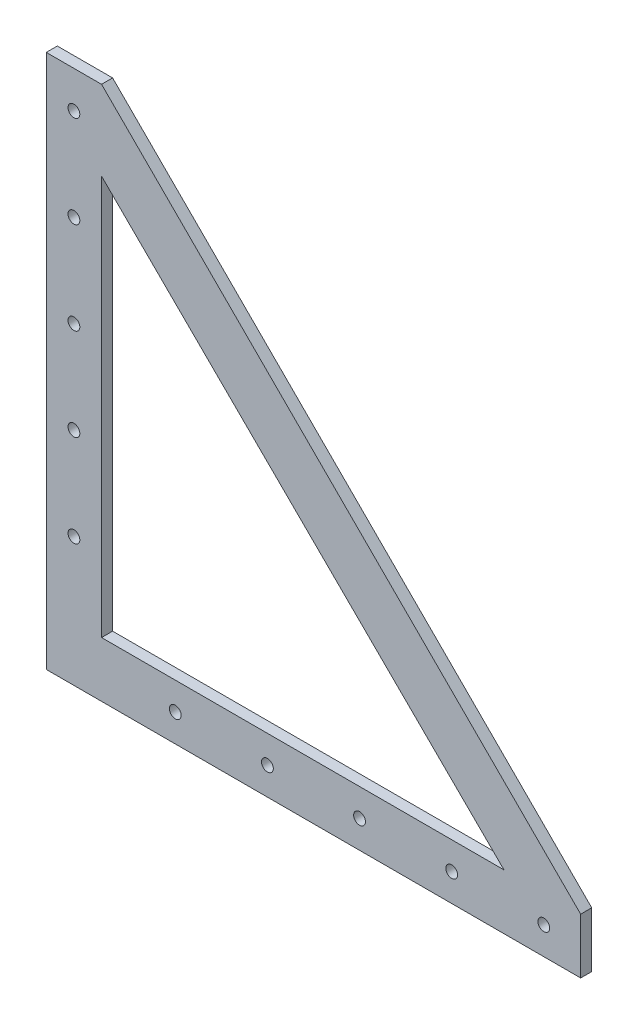
ISO-10303-21;
HEADER;
FILE_DESCRIPTION(('STEP AP214'),'2;1');
FILE_NAME('part.step','',(''),(''),'','','');
FILE_SCHEMA(('AUTOMOTIVE_DESIGN { 1 0 10303 214 1 1 1 1 }'));
ENDSEC;
DATA;
#1=APPLICATION_CONTEXT('core data for automotive mechanical design processes');
#2=APPLICATION_PROTOCOL_DEFINITION('international standard','automotive_design',2000,#1);
#3=PRODUCT_CONTEXT('',#1,'mechanical');
#4=PRODUCT('Part','Part','',(#3));
#5=PRODUCT_RELATED_PRODUCT_CATEGORY('part','',(#4));
#6=PRODUCT_DEFINITION_FORMATION('','',#4);
#7=PRODUCT_DEFINITION_CONTEXT('part definition',#1,'design');
#8=PRODUCT_DEFINITION('design','',#6,#7);
#9=PRODUCT_DEFINITION_SHAPE('','',#8);
#10=(LENGTH_UNIT() NAMED_UNIT(*) SI_UNIT(.MILLI.,.METRE.));
#11=(NAMED_UNIT(*) PLANE_ANGLE_UNIT() SI_UNIT($,.RADIAN.));
#12=(NAMED_UNIT(*) SI_UNIT($,.STERADIAN.) SOLID_ANGLE_UNIT());
#13=UNCERTAINTY_MEASURE_WITH_UNIT(LENGTH_MEASURE(1.E-05),#10,'distance_accuracy_value','');
#14=(GEOMETRIC_REPRESENTATION_CONTEXT(3) GLOBAL_UNCERTAINTY_ASSIGNED_CONTEXT((#13)) GLOBAL_UNIT_ASSIGNED_CONTEXT((#10,
#11,#12)) REPRESENTATION_CONTEXT('',''));
#15=CARTESIAN_POINT('',(0.,0.,0.));
#16=DIRECTION('',(0.,0.,1.));
#17=DIRECTION('',(1.,0.,0.));
#18=AXIS2_PLACEMENT_3D('',#15,#16,#17);
#19=CARTESIAN_POINT('',(0.,0.,3.));
#20=DIRECTION('',(0.,0.,1.));
#21=DIRECTION('',(1.,0.,0.));
#22=AXIS2_PLACEMENT_3D('',#19,#20,#21);
#23=PLANE('',#22);
#24=CARTESIAN_POINT('',(7.50000000000079,60.,3.));
#25=DIRECTION('',(0.,0.,1.));
#26=DIRECTION('',(1.,0.,0.));
#27=AXIS2_PLACEMENT_3D('',#24,#25,#26);
#28=CIRCLE('',#27,1.59999999999999);
#29=CARTESIAN_POINT('',(9.10000000000078,60.,3.));
#30=VERTEX_POINT('',#29);
#31=EDGE_CURVE('E416',#30,#30,#28,.T.);
#32=ORIENTED_EDGE('',*,*,#31,.F.);
#33=EDGE_LOOP('',(#32));
#34=FACE_BOUND('',#33,.T.);
#35=CARTESIAN_POINT('',(7.50000000000026,110.,3.));
#36=DIRECTION('',(0.,0.,1.));
#37=DIRECTION('',(1.,0.,0.));
#38=AXIS2_PLACEMENT_3D('',#35,#36,#37);
#39=CIRCLE('',#38,1.59999999999999);
#40=CARTESIAN_POINT('',(9.10000000000026,110.,3.));
#41=VERTEX_POINT('',#40);
#42=EDGE_CURVE('E122',#41,#41,#39,.T.);
#43=ORIENTED_EDGE('',*,*,#42,.F.);
#44=EDGE_LOOP('',(#43));
#45=FACE_BOUND('',#44,.T.);
#46=CARTESIAN_POINT('',(35.,7.4999999999993,3.));
#47=DIRECTION('',(0.,0.,1.));
#48=DIRECTION('',(1.,0.,0.));
#49=AXIS2_PLACEMENT_3D('',#46,#47,#48);
#50=CIRCLE('',#49,1.59999999999999);
#51=CARTESIAN_POINT('',(36.6,7.4999999999993,3.));
#52=VERTEX_POINT('',#51);
#53=EDGE_CURVE('E128',#52,#52,#50,.T.);
#54=ORIENTED_EDGE('',*,*,#53,.F.);
#55=EDGE_LOOP('',(#54));
#56=FACE_BOUND('',#55,.T.);
#57=CARTESIAN_POINT('',(85.,7.49999999999965,3.));
#58=DIRECTION('',(0.,0.,1.));
#59=DIRECTION('',(1.,0.,0.));
#60=AXIS2_PLACEMENT_3D('',#57,#58,#59);
#61=CIRCLE('',#60,1.59999999999999);
#62=CARTESIAN_POINT('',(86.6,7.49999999999965,3.));
#63=VERTEX_POINT('',#62);
#64=EDGE_CURVE('E140',#63,#63,#61,.T.);
#65=ORIENTED_EDGE('',*,*,#64,.F.);
#66=EDGE_LOOP('',(#65));
#67=FACE_BOUND('',#66,.T.);
#68=CARTESIAN_POINT('',(7.5,135.,3.));
#69=DIRECTION('',(0.,0.,1.));
#70=DIRECTION('',(1.,0.,0.));
#71=AXIS2_PLACEMENT_3D('',#68,#69,#70);
#72=CIRCLE('',#71,1.59999999999999);
#73=CARTESIAN_POINT('',(9.1,135.,3.));
#74=VERTEX_POINT('',#73);
#75=EDGE_CURVE('E152',#74,#74,#72,.T.);
#76=ORIENTED_EDGE('',*,*,#75,.F.);
#77=EDGE_LOOP('',(#76));
#78=FACE_BOUND('',#77,.T.);
#79=DIRECTION('',(-1.,0.,0.));
#80=VECTOR('',#79,1.);
#81=CARTESIAN_POINT('',(15.,145.,3.));
#82=LINE('',#81,#80);
#83=CARTESIAN_POINT('',(15.,145.,3.));
#84=VERTEX_POINT('',#83);
#85=CARTESIAN_POINT('',(0.,145.,3.));
#86=VERTEX_POINT('',#85);
#87=EDGE_CURVE('E164',#84,#86,#82,.T.);
#88=ORIENTED_EDGE('',*,*,#87,.T.);
#89=DIRECTION('',(0.,-1.,0.));
#90=VECTOR('',#89,1.);
#91=CARTESIAN_POINT('',(0.,145.,3.));
#92=LINE('',#91,#90);
#93=CARTESIAN_POINT('',(0.,0.,3.));
#94=VERTEX_POINT('',#93);
#95=EDGE_CURVE('E167',#86,#94,#92,.T.);
#96=ORIENTED_EDGE('',*,*,#95,.T.);
#97=DIRECTION('',(1.,0.,0.));
#98=VECTOR('',#97,1.);
#99=CARTESIAN_POINT('',(0.,0.,3.));
#100=LINE('',#99,#98);
#101=CARTESIAN_POINT('',(145.,0.,3.));
#102=VERTEX_POINT('',#101);
#103=EDGE_CURVE('E170',#94,#102,#100,.T.);
#104=ORIENTED_EDGE('',*,*,#103,.T.);
#105=DIRECTION('',(0.,1.,0.));
#106=VECTOR('',#105,1.);
#107=CARTESIAN_POINT('',(145.,0.,3.));
#108=LINE('',#107,#106);
#109=CARTESIAN_POINT('',(145.,15.,3.));
#110=VERTEX_POINT('',#109);
#111=EDGE_CURVE('E172',#102,#110,#108,.T.);
#112=ORIENTED_EDGE('',*,*,#111,.T.);
#113=DIRECTION('',(-0.707106781186547,0.707106781186547,0.));
#114=VECTOR('',#113,1.);
#115=CARTESIAN_POINT('',(145.,15.,3.));
#116=LINE('',#115,#114);
#117=EDGE_CURVE('E174',#110,#84,#116,.T.);
#118=ORIENTED_EDGE('',*,*,#117,.T.);
#119=EDGE_LOOP('',(#88,#96,#104,#112,#118));
#120=FACE_BOUND('',#119,.T.);
#121=CARTESIAN_POINT('',(135.,7.5,3.));
#122=DIRECTION('',(0.,0.,1.));
#123=DIRECTION('',(1.,0.,0.));
#124=AXIS2_PLACEMENT_3D('',#121,#122,#123);
#125=CIRCLE('',#124,1.59999999999999);
#126=CARTESIAN_POINT('',(136.6,7.5,3.));
#127=VERTEX_POINT('',#126);
#128=EDGE_CURVE('E158',#127,#127,#125,.T.);
#129=ORIENTED_EDGE('',*,*,#128,.F.);
#130=EDGE_LOOP('',(#129));
#131=FACE_BOUND('',#130,.T.);
#132=CARTESIAN_POINT('',(110.,7.49999999999982,3.));
#133=DIRECTION('',(0.,0.,1.));
#134=DIRECTION('',(1.,0.,0.));
#135=AXIS2_PLACEMENT_3D('',#132,#133,#134);
#136=CIRCLE('',#135,1.59999999999999);
#137=CARTESIAN_POINT('',(111.6,7.49999999999982,3.));
#138=VERTEX_POINT('',#137);
#139=EDGE_CURVE('E146',#138,#138,#136,.T.);
#140=ORIENTED_EDGE('',*,*,#139,.F.);
#141=EDGE_LOOP('',(#140));
#142=FACE_BOUND('',#141,.T.);
#143=CARTESIAN_POINT('',(60.,7.49999999999948,3.));
#144=DIRECTION('',(0.,0.,1.));
#145=DIRECTION('',(1.,0.,0.));
#146=AXIS2_PLACEMENT_3D('',#143,#144,#145);
#147=CIRCLE('',#146,1.59999999999999);
#148=CARTESIAN_POINT('',(61.6,7.49999999999948,3.));
#149=VERTEX_POINT('',#148);
#150=EDGE_CURVE('E134',#149,#149,#147,.T.);
#151=ORIENTED_EDGE('',*,*,#150,.F.);
#152=EDGE_LOOP('',(#151));
#153=FACE_BOUND('',#152,.T.);
#154=DIRECTION('',(0.,-1.,0.));
#155=VECTOR('',#154,1.);
#156=CARTESIAN_POINT('',(15.,123.418535773091,3.));
#157=LINE('',#156,#155);
#158=CARTESIAN_POINT('',(15.,123.418535773091,3.));
#159=VERTEX_POINT('',#158);
#160=CARTESIAN_POINT('',(15.,15.,3.));
#161=VERTEX_POINT('',#160);
#162=EDGE_CURVE('E106',#159,#161,#157,.T.);
#163=ORIENTED_EDGE('',*,*,#162,.F.);
#164=DIRECTION('',(-0.709652126815732,0.704552240011987,0.));
#165=VECTOR('',#164,1.);
#166=CARTESIAN_POINT('',(124.203321099813,15.,3.));
#167=LINE('',#166,#165);
#168=CARTESIAN_POINT('',(124.203321099813,15.,3.));
#169=VERTEX_POINT('',#168);
#170=EDGE_CURVE('E98',#169,#159,#167,.T.);
#171=ORIENTED_EDGE('',*,*,#170,.F.);
#172=DIRECTION('',(1.,0.,0.));
#173=VECTOR('',#172,1.);
#174=CARTESIAN_POINT('',(15.,15.,3.));
#175=LINE('',#174,#173);
#176=EDGE_CURVE('E116',#161,#169,#175,.T.);
#177=ORIENTED_EDGE('',*,*,#176,.F.);
#178=EDGE_LOOP('',(#163,#171,#177));
#179=FACE_BOUND('',#178,.T.);
#180=CARTESIAN_POINT('',(7.50000000000052,85.,3.));
#181=DIRECTION('',(0.,0.,1.));
#182=DIRECTION('',(1.,0.,0.));
#183=AXIS2_PLACEMENT_3D('',#180,#181,#182);
#184=CIRCLE('',#183,1.59999999999999);
#185=CARTESIAN_POINT('',(9.10000000000052,85.,3.));
#186=VERTEX_POINT('',#185);
#187=EDGE_CURVE('E422',#186,#186,#184,.T.);
#188=ORIENTED_EDGE('',*,*,#187,.F.);
#189=EDGE_LOOP('',(#188));
#190=FACE_BOUND('',#189,.T.);
#191=CARTESIAN_POINT('',(7.50000000000105,35.,3.));
#192=DIRECTION('',(0.,0.,1.));
#193=DIRECTION('',(1.,0.,0.));
#194=AXIS2_PLACEMENT_3D('',#191,#192,#193);
#195=CIRCLE('',#194,1.59999999999999);
#196=CARTESIAN_POINT('',(9.10000000000104,35.,3.));
#197=VERTEX_POINT('',#196);
#198=EDGE_CURVE('E407',#197,#197,#195,.T.);
#199=ORIENTED_EDGE('',*,*,#198,.F.);
#200=EDGE_LOOP('',(#199));
#201=FACE_BOUND('',#200,.T.);
#202=ADVANCED_FACE('F33',(#34,#45,#56,#67,#78,#120,#131,#142,#153,#179,#190,#201),#23,.T.);
#203=CARTESIAN_POINT('',(0.,0.,0.));
#204=DIRECTION('',(0.,0.,1.));
#205=DIRECTION('',(1.,0.,0.));
#206=AXIS2_PLACEMENT_3D('',#203,#204,#205);
#207=PLANE('',#206);
#208=CARTESIAN_POINT('',(7.50000000000079,60.,0.));
#209=DIRECTION('',(0.,0.,1.));
#210=DIRECTION('',(1.,0.,0.));
#211=AXIS2_PLACEMENT_3D('',#208,#209,#210);
#212=CIRCLE('',#211,1.59999999999999);
#213=CARTESIAN_POINT('',(9.10000000000078,60.,0.));
#214=VERTEX_POINT('',#213);
#215=EDGE_CURVE('E413',#214,#214,#212,.T.);
#216=ORIENTED_EDGE('',*,*,#215,.T.);
#217=EDGE_LOOP('',(#216));
#218=FACE_BOUND('',#217,.T.);
#219=CARTESIAN_POINT('',(7.50000000000026,110.,0.));
#220=DIRECTION('',(0.,0.,1.));
#221=DIRECTION('',(1.,0.,0.));
#222=AXIS2_PLACEMENT_3D('',#219,#220,#221);
#223=CIRCLE('',#222,1.59999999999999);
#224=CARTESIAN_POINT('',(9.10000000000026,110.,0.));
#225=VERTEX_POINT('',#224);
#226=EDGE_CURVE('E425',#225,#225,#223,.T.);
#227=ORIENTED_EDGE('',*,*,#226,.T.);
#228=EDGE_LOOP('',(#227));
#229=FACE_BOUND('',#228,.T.);
#230=CARTESIAN_POINT('',(35.,7.4999999999993,0.));
#231=DIRECTION('',(0.,0.,1.));
#232=DIRECTION('',(1.,0.,0.));
#233=AXIS2_PLACEMENT_3D('',#230,#231,#232);
#234=CIRCLE('',#233,1.59999999999999);
#235=CARTESIAN_POINT('',(36.6,7.4999999999993,0.));
#236=VERTEX_POINT('',#235);
#237=EDGE_CURVE('E113',#236,#236,#234,.T.);
#238=ORIENTED_EDGE('',*,*,#237,.T.);
#239=EDGE_LOOP('',(#238));
#240=FACE_BOUND('',#239,.T.);
#241=CARTESIAN_POINT('',(85.,7.49999999999965,0.));
#242=DIRECTION('',(0.,0.,1.));
#243=DIRECTION('',(1.,0.,0.));
#244=AXIS2_PLACEMENT_3D('',#241,#242,#243);
#245=CIRCLE('',#244,1.59999999999999);
#246=CARTESIAN_POINT('',(86.6,7.49999999999965,0.));
#247=VERTEX_POINT('',#246);
#248=EDGE_CURVE('E137',#247,#247,#245,.T.);
#249=ORIENTED_EDGE('',*,*,#248,.T.);
#250=EDGE_LOOP('',(#249));
#251=FACE_BOUND('',#250,.T.);
#252=CARTESIAN_POINT('',(7.5,135.,0.));
#253=DIRECTION('',(0.,0.,1.));
#254=DIRECTION('',(1.,0.,0.));
#255=AXIS2_PLACEMENT_3D('',#252,#253,#254);
#256=CIRCLE('',#255,1.59999999999999);
#257=CARTESIAN_POINT('',(9.1,135.,0.));
#258=VERTEX_POINT('',#257);
#259=EDGE_CURVE('E149',#258,#258,#256,.T.);
#260=ORIENTED_EDGE('',*,*,#259,.T.);
#261=EDGE_LOOP('',(#260));
#262=FACE_BOUND('',#261,.T.);
#263=DIRECTION('',(-1.,0.,0.));
#264=VECTOR('',#263,1.);
#265=CARTESIAN_POINT('',(15.,145.,0.));
#266=LINE('',#265,#264);
#267=CARTESIAN_POINT('',(15.,145.,0.));
#268=VERTEX_POINT('',#267);
#269=CARTESIAN_POINT('',(0.,145.,0.));
#270=VERTEX_POINT('',#269);
#271=EDGE_CURVE('E161',#268,#270,#266,.T.);
#272=ORIENTED_EDGE('',*,*,#271,.F.);
#273=DIRECTION('',(-0.707106781186547,0.707106781186547,0.));
#274=VECTOR('',#273,1.);
#275=CARTESIAN_POINT('',(145.,15.,0.));
#276=LINE('',#275,#274);
#277=CARTESIAN_POINT('',(145.,15.,0.));
#278=VERTEX_POINT('',#277);
#279=EDGE_CURVE('E168',#278,#268,#276,.T.);
#280=ORIENTED_EDGE('',*,*,#279,.F.);
#281=DIRECTION('',(0.,1.,0.));
#282=VECTOR('',#281,1.);
#283=CARTESIAN_POINT('',(145.,0.,0.));
#284=LINE('',#283,#282);
#285=CARTESIAN_POINT('',(145.,0.,0.));
#286=VERTEX_POINT('',#285);
#287=EDGE_CURVE('E183',#286,#278,#284,.T.);
#288=ORIENTED_EDGE('',*,*,#287,.F.);
#289=DIRECTION('',(1.,0.,0.));
#290=VECTOR('',#289,1.);
#291=CARTESIAN_POINT('',(0.,0.,0.));
#292=LINE('',#291,#290);
#293=CARTESIAN_POINT('',(0.,0.,0.));
#294=VERTEX_POINT('',#293);
#295=EDGE_CURVE('E181',#294,#286,#292,.T.);
#296=ORIENTED_EDGE('',*,*,#295,.F.);
#297=DIRECTION('',(0.,-1.,0.));
#298=VECTOR('',#297,1.);
#299=CARTESIAN_POINT('',(0.,145.,0.));
#300=LINE('',#299,#298);
#301=EDGE_CURVE('E179',#270,#294,#300,.T.);
#302=ORIENTED_EDGE('',*,*,#301,.F.);
#303=EDGE_LOOP('',(#272,#280,#288,#296,#302));
#304=FACE_BOUND('',#303,.T.);
#305=CARTESIAN_POINT('',(135.,7.5,0.));
#306=DIRECTION('',(0.,0.,1.));
#307=DIRECTION('',(1.,0.,0.));
#308=AXIS2_PLACEMENT_3D('',#305,#306,#307);
#309=CIRCLE('',#308,1.59999999999999);
#310=CARTESIAN_POINT('',(136.6,7.5,0.));
#311=VERTEX_POINT('',#310);
#312=EDGE_CURVE('E155',#311,#311,#309,.T.);
#313=ORIENTED_EDGE('',*,*,#312,.T.);
#314=EDGE_LOOP('',(#313));
#315=FACE_BOUND('',#314,.T.);
#316=CARTESIAN_POINT('',(110.,7.49999999999982,0.));
#317=DIRECTION('',(0.,0.,1.));
#318=DIRECTION('',(1.,0.,0.));
#319=AXIS2_PLACEMENT_3D('',#316,#317,#318);
#320=CIRCLE('',#319,1.59999999999999);
#321=CARTESIAN_POINT('',(111.6,7.49999999999982,0.));
#322=VERTEX_POINT('',#321);
#323=EDGE_CURVE('E143',#322,#322,#320,.T.);
#324=ORIENTED_EDGE('',*,*,#323,.T.);
#325=EDGE_LOOP('',(#324));
#326=FACE_BOUND('',#325,.T.);
#327=CARTESIAN_POINT('',(60.,7.49999999999948,0.));
#328=DIRECTION('',(0.,0.,1.));
#329=DIRECTION('',(1.,0.,0.));
#330=AXIS2_PLACEMENT_3D('',#327,#328,#329);
#331=CIRCLE('',#330,1.59999999999999);
#332=CARTESIAN_POINT('',(61.6,7.49999999999948,0.));
#333=VERTEX_POINT('',#332);
#334=EDGE_CURVE('E131',#333,#333,#331,.T.);
#335=ORIENTED_EDGE('',*,*,#334,.T.);
#336=EDGE_LOOP('',(#335));
#337=FACE_BOUND('',#336,.T.);
#338=DIRECTION('',(-0.709652126815732,0.704552240011987,0.));
#339=VECTOR('',#338,1.);
#340=CARTESIAN_POINT('',(124.203321099813,15.,0.));
#341=LINE('',#340,#339);
#342=CARTESIAN_POINT('',(124.203321099813,15.,0.));
#343=VERTEX_POINT('',#342);
#344=CARTESIAN_POINT('',(15.,123.418535773091,0.));
#345=VERTEX_POINT('',#344);
#346=EDGE_CURVE('E56',#343,#345,#341,.T.);
#347=ORIENTED_EDGE('',*,*,#346,.T.);
#348=DIRECTION('',(0.,-1.,0.));
#349=VECTOR('',#348,1.);
#350=CARTESIAN_POINT('',(15.,123.418535773091,0.));
#351=LINE('',#350,#349);
#352=CARTESIAN_POINT('',(15.,15.,0.));
#353=VERTEX_POINT('',#352);
#354=EDGE_CURVE('E112',#345,#353,#351,.T.);
#355=ORIENTED_EDGE('',*,*,#354,.T.);
#356=DIRECTION('',(1.,0.,0.));
#357=VECTOR('',#356,1.);
#358=CARTESIAN_POINT('',(15.,15.,0.));
#359=LINE('',#358,#357);
#360=EDGE_CURVE('E107',#353,#343,#359,.T.);
#361=ORIENTED_EDGE('',*,*,#360,.T.);
#362=EDGE_LOOP('',(#347,#355,#361));
#363=FACE_BOUND('',#362,.T.);
#364=CARTESIAN_POINT('',(7.50000000000052,85.,0.));
#365=DIRECTION('',(0.,0.,1.));
#366=DIRECTION('',(1.,0.,0.));
#367=AXIS2_PLACEMENT_3D('',#364,#365,#366);
#368=CIRCLE('',#367,1.59999999999999);
#369=CARTESIAN_POINT('',(9.10000000000052,85.,0.));
#370=VERTEX_POINT('',#369);
#371=EDGE_CURVE('E419',#370,#370,#368,.T.);
#372=ORIENTED_EDGE('',*,*,#371,.T.);
#373=EDGE_LOOP('',(#372));
#374=FACE_BOUND('',#373,.T.);
#375=CARTESIAN_POINT('',(7.50000000000105,35.,0.));
#376=DIRECTION('',(0.,0.,1.));
#377=DIRECTION('',(1.,0.,0.));
#378=AXIS2_PLACEMENT_3D('',#375,#376,#377);
#379=CIRCLE('',#378,1.59999999999999);
#380=CARTESIAN_POINT('',(9.10000000000104,35.,0.));
#381=VERTEX_POINT('',#380);
#382=EDGE_CURVE('E410',#381,#381,#379,.T.);
#383=ORIENTED_EDGE('',*,*,#382,.T.);
#384=EDGE_LOOP('',(#383));
#385=FACE_BOUND('',#384,.T.);
#386=ADVANCED_FACE('F204',(#218,#229,#240,#251,#262,#304,#315,#326,#337,#363,#374,#385),#207,.F.);
#387=CARTESIAN_POINT('',(15.,145.,3.));
#388=DIRECTION('',(0.,-1.,0.));
#389=DIRECTION('',(0.,0.,-1.));
#390=AXIS2_PLACEMENT_3D('',#387,#388,#389);
#391=PLANE('',#390);
#392=ORIENTED_EDGE('',*,*,#271,.T.);
#393=DIRECTION('',(0.,0.,-1.));
#394=VECTOR('',#393,1.);
#395=CARTESIAN_POINT('',(0.,145.,3.));
#396=LINE('',#395,#394);
#397=EDGE_CURVE('E11',#86,#270,#396,.T.);
#398=ORIENTED_EDGE('',*,*,#397,.F.);
#399=ORIENTED_EDGE('',*,*,#87,.F.);
#400=DIRECTION('',(0.,0.,-1.));
#401=VECTOR('',#400,1.);
#402=CARTESIAN_POINT('',(15.,145.,3.));
#403=LINE('',#402,#401);
#404=EDGE_CURVE('E176',#84,#268,#403,.T.);
#405=ORIENTED_EDGE('',*,*,#404,.T.);
#406=EDGE_LOOP('',(#392,#398,#399,#405));
#407=FACE_BOUND('',#406,.T.);
#408=ADVANCED_FACE('F35',(#407),#391,.F.);
#409=CARTESIAN_POINT('',(0.,145.,3.));
#410=DIRECTION('',(1.,0.,0.));
#411=DIRECTION('',(0.,1.,0.));
#412=AXIS2_PLACEMENT_3D('',#409,#410,#411);
#413=PLANE('',#412);
#414=ORIENTED_EDGE('',*,*,#301,.T.);
#415=DIRECTION('',(0.,0.,-1.));
#416=VECTOR('',#415,1.);
#417=CARTESIAN_POINT('',(0.,0.,3.));
#418=LINE('',#417,#416);
#419=EDGE_CURVE('E41',#94,#294,#418,.T.);
#420=ORIENTED_EDGE('',*,*,#419,.F.);
#421=ORIENTED_EDGE('',*,*,#95,.F.);
#422=ORIENTED_EDGE('',*,*,#397,.T.);
#423=EDGE_LOOP('',(#414,#420,#421,#422));
#424=FACE_BOUND('',#423,.T.);
#425=ADVANCED_FACE('F219',(#424),#413,.F.);
#426=CARTESIAN_POINT('',(0.,0.,3.));
#427=DIRECTION('',(0.,1.,0.));
#428=DIRECTION('',(0.,0.,1.));
#429=AXIS2_PLACEMENT_3D('',#426,#427,#428);
#430=PLANE('',#429);
#431=ORIENTED_EDGE('',*,*,#295,.T.);
#432=DIRECTION('',(0.,0.,-1.));
#433=VECTOR('',#432,1.);
#434=CARTESIAN_POINT('',(145.,0.,3.));
#435=LINE('',#434,#433);
#436=EDGE_CURVE('E191',#102,#286,#435,.T.);
#437=ORIENTED_EDGE('',*,*,#436,.F.);
#438=ORIENTED_EDGE('',*,*,#103,.F.);
#439=ORIENTED_EDGE('',*,*,#419,.T.);
#440=EDGE_LOOP('',(#431,#437,#438,#439));
#441=FACE_BOUND('',#440,.T.);
#442=ADVANCED_FACE('F198',(#441),#430,.F.);
#443=CARTESIAN_POINT('',(145.,0.,3.));
#444=DIRECTION('',(-1.,0.,0.));
#445=DIRECTION('',(0.,0.,1.));
#446=AXIS2_PLACEMENT_3D('',#443,#444,#445);
#447=PLANE('',#446);
#448=ORIENTED_EDGE('',*,*,#287,.T.);
#449=DIRECTION('',(0.,0.,-1.));
#450=VECTOR('',#449,1.);
#451=CARTESIAN_POINT('',(145.,15.,3.));
#452=LINE('',#451,#450);
#453=EDGE_CURVE('E188',#110,#278,#452,.T.);
#454=ORIENTED_EDGE('',*,*,#453,.F.);
#455=ORIENTED_EDGE('',*,*,#111,.F.);
#456=ORIENTED_EDGE('',*,*,#436,.T.);
#457=EDGE_LOOP('',(#448,#454,#455,#456));
#458=FACE_BOUND('',#457,.T.);
#459=ADVANCED_FACE('F209',(#458),#447,.F.);
#460=CARTESIAN_POINT('',(145.,15.,3.));
#461=DIRECTION('',(-0.707106781186548,-0.707106781186548,0.));
#462=DIRECTION('',(0.707106781186548,-0.707106781186548,0.));
#463=AXIS2_PLACEMENT_3D('',#460,#461,#462);
#464=PLANE('',#463);
#465=ORIENTED_EDGE('',*,*,#279,.T.);
#466=ORIENTED_EDGE('',*,*,#404,.F.);
#467=ORIENTED_EDGE('',*,*,#117,.F.);
#468=ORIENTED_EDGE('',*,*,#453,.T.);
#469=EDGE_LOOP('',(#465,#466,#467,#468));
#470=FACE_BOUND('',#469,.T.);
#471=ADVANCED_FACE('F213',(#470),#464,.F.);
#472=CARTESIAN_POINT('',(135.,7.5,3.));
#473=DIRECTION('',(0.,0.,-1.));
#474=DIRECTION('',(-1.,0.,0.));
#475=AXIS2_PLACEMENT_3D('',#472,#473,#474);
#476=CYLINDRICAL_SURFACE('',#475,1.59999999999999);
#477=ORIENTED_EDGE('',*,*,#128,.T.);
#478=EDGE_LOOP('',(#477));
#479=FACE_BOUND('',#478,.T.);
#480=ORIENTED_EDGE('',*,*,#312,.F.);
#481=EDGE_LOOP('',(#480));
#482=FACE_BOUND('',#481,.T.);
#483=ADVANCED_FACE('F236',(#479,#482),#476,.F.);
#484=CARTESIAN_POINT('',(7.5,135.,3.));
#485=DIRECTION('',(0.,0.,-1.));
#486=DIRECTION('',(-1.,0.,0.));
#487=AXIS2_PLACEMENT_3D('',#484,#485,#486);
#488=CYLINDRICAL_SURFACE('',#487,1.59999999999999);
#489=ORIENTED_EDGE('',*,*,#75,.T.);
#490=EDGE_LOOP('',(#489));
#491=FACE_BOUND('',#490,.T.);
#492=ORIENTED_EDGE('',*,*,#259,.F.);
#493=EDGE_LOOP('',(#492));
#494=FACE_BOUND('',#493,.T.);
#495=ADVANCED_FACE('F262',(#491,#494),#488,.F.);
#496=CARTESIAN_POINT('',(110.,7.49999999999982,3.));
#497=DIRECTION('',(0.,0.,-1.));
#498=DIRECTION('',(-1.,0.,0.));
#499=AXIS2_PLACEMENT_3D('',#496,#497,#498);
#500=CYLINDRICAL_SURFACE('',#499,1.59999999999999);
#501=ORIENTED_EDGE('',*,*,#139,.T.);
#502=EDGE_LOOP('',(#501));
#503=FACE_BOUND('',#502,.T.);
#504=ORIENTED_EDGE('',*,*,#323,.F.);
#505=EDGE_LOOP('',(#504));
#506=FACE_BOUND('',#505,.T.);
#507=ADVANCED_FACE('F269',(#503,#506),#500,.F.);
#508=CARTESIAN_POINT('',(85.,7.49999999999965,3.));
#509=DIRECTION('',(0.,0.,-1.));
#510=DIRECTION('',(-1.,0.,0.));
#511=AXIS2_PLACEMENT_3D('',#508,#509,#510);
#512=CYLINDRICAL_SURFACE('',#511,1.59999999999999);
#513=ORIENTED_EDGE('',*,*,#64,.T.);
#514=EDGE_LOOP('',(#513));
#515=FACE_BOUND('',#514,.T.);
#516=ORIENTED_EDGE('',*,*,#248,.F.);
#517=EDGE_LOOP('',(#516));
#518=FACE_BOUND('',#517,.T.);
#519=ADVANCED_FACE('F276',(#515,#518),#512,.F.);
#520=CARTESIAN_POINT('',(60.,7.49999999999948,3.));
#521=DIRECTION('',(0.,0.,-1.));
#522=DIRECTION('',(-1.,0.,0.));
#523=AXIS2_PLACEMENT_3D('',#520,#521,#522);
#524=CYLINDRICAL_SURFACE('',#523,1.59999999999999);
#525=ORIENTED_EDGE('',*,*,#150,.T.);
#526=EDGE_LOOP('',(#525));
#527=FACE_BOUND('',#526,.T.);
#528=ORIENTED_EDGE('',*,*,#334,.F.);
#529=EDGE_LOOP('',(#528));
#530=FACE_BOUND('',#529,.T.);
#531=ADVANCED_FACE('F284',(#527,#530),#524,.F.);
#532=CARTESIAN_POINT('',(35.,7.4999999999993,3.));
#533=DIRECTION('',(0.,0.,-1.));
#534=DIRECTION('',(-1.,0.,0.));
#535=AXIS2_PLACEMENT_3D('',#532,#533,#534);
#536=CYLINDRICAL_SURFACE('',#535,1.59999999999999);
#537=ORIENTED_EDGE('',*,*,#53,.T.);
#538=EDGE_LOOP('',(#537));
#539=FACE_BOUND('',#538,.T.);
#540=ORIENTED_EDGE('',*,*,#237,.F.);
#541=EDGE_LOOP('',(#540));
#542=FACE_BOUND('',#541,.T.);
#543=ADVANCED_FACE('F292',(#539,#542),#536,.F.);
#544=CARTESIAN_POINT('',(124.203321099813,15.,3.));
#545=DIRECTION('',(-0.704552240011987,-0.709652126815732,0.));
#546=DIRECTION('',(0.709652126815732,-0.704552240011987,0.));
#547=AXIS2_PLACEMENT_3D('',#544,#545,#546);
#548=PLANE('',#547);
#549=ORIENTED_EDGE('',*,*,#346,.F.);
#550=DIRECTION('',(0.,0.,-1.));
#551=VECTOR('',#550,1.);
#552=CARTESIAN_POINT('',(124.203321099813,15.,3.));
#553=LINE('',#552,#551);
#554=EDGE_CURVE('E102',#169,#343,#553,.T.);
#555=ORIENTED_EDGE('',*,*,#554,.F.);
#556=ORIENTED_EDGE('',*,*,#170,.T.);
#557=DIRECTION('',(0.,0.,-1.));
#558=VECTOR('',#557,1.);
#559=CARTESIAN_POINT('',(15.,123.418535773091,3.));
#560=LINE('',#559,#558);
#561=EDGE_CURVE('E101',#159,#345,#560,.T.);
#562=ORIENTED_EDGE('',*,*,#561,.T.);
#563=EDGE_LOOP('',(#549,#555,#556,#562));
#564=FACE_BOUND('',#563,.T.);
#565=ADVANCED_FACE('F100',(#564),#548,.T.);
#566=CARTESIAN_POINT('',(15.,123.418535773091,3.));
#567=DIRECTION('',(1.,0.,0.));
#568=DIRECTION('',(0.,0.,-1.));
#569=AXIS2_PLACEMENT_3D('',#566,#567,#568);
#570=PLANE('',#569);
#571=ORIENTED_EDGE('',*,*,#354,.F.);
#572=ORIENTED_EDGE('',*,*,#561,.F.);
#573=ORIENTED_EDGE('',*,*,#162,.T.);
#574=DIRECTION('',(0.,0.,-1.));
#575=VECTOR('',#574,1.);
#576=CARTESIAN_POINT('',(15.,15.,3.));
#577=LINE('',#576,#575);
#578=EDGE_CURVE('E48',#161,#353,#577,.T.);
#579=ORIENTED_EDGE('',*,*,#578,.T.);
#580=EDGE_LOOP('',(#571,#572,#573,#579));
#581=FACE_BOUND('',#580,.T.);
#582=ADVANCED_FACE('F110',(#581),#570,.T.);
#583=CARTESIAN_POINT('',(15.,15.,3.));
#584=DIRECTION('',(0.,1.,0.));
#585=DIRECTION('',(0.,0.,1.));
#586=AXIS2_PLACEMENT_3D('',#583,#584,#585);
#587=PLANE('',#586);
#588=ORIENTED_EDGE('',*,*,#360,.F.);
#589=ORIENTED_EDGE('',*,*,#578,.F.);
#590=ORIENTED_EDGE('',*,*,#176,.T.);
#591=ORIENTED_EDGE('',*,*,#554,.T.);
#592=EDGE_LOOP('',(#588,#589,#590,#591));
#593=FACE_BOUND('',#592,.T.);
#594=ADVANCED_FACE('F313',(#593),#587,.T.);
#595=CARTESIAN_POINT('',(7.50000000000026,110.,3.));
#596=DIRECTION('',(0.,0.,-1.));
#597=DIRECTION('',(-1.,0.,0.));
#598=AXIS2_PLACEMENT_3D('',#595,#596,#597);
#599=CYLINDRICAL_SURFACE('',#598,1.59999999999999);
#600=ORIENTED_EDGE('',*,*,#42,.T.);
#601=EDGE_LOOP('',(#600));
#602=FACE_BOUND('',#601,.T.);
#603=ORIENTED_EDGE('',*,*,#226,.F.);
#604=EDGE_LOOP('',(#603));
#605=FACE_BOUND('',#604,.T.);
#606=ADVANCED_FACE('F320',(#602,#605),#599,.F.);
#607=CARTESIAN_POINT('',(7.50000000000052,85.,3.));
#608=DIRECTION('',(0.,0.,-1.));
#609=DIRECTION('',(-1.,0.,0.));
#610=AXIS2_PLACEMENT_3D('',#607,#608,#609);
#611=CYLINDRICAL_SURFACE('',#610,1.59999999999999);
#612=ORIENTED_EDGE('',*,*,#187,.T.);
#613=EDGE_LOOP('',(#612));
#614=FACE_BOUND('',#613,.T.);
#615=ORIENTED_EDGE('',*,*,#371,.F.);
#616=EDGE_LOOP('',(#615));
#617=FACE_BOUND('',#616,.T.);
#618=ADVANCED_FACE('F327',(#614,#617),#611,.F.);
#619=CARTESIAN_POINT('',(7.50000000000079,60.,3.));
#620=DIRECTION('',(0.,0.,-1.));
#621=DIRECTION('',(-1.,0.,0.));
#622=AXIS2_PLACEMENT_3D('',#619,#620,#621);
#623=CYLINDRICAL_SURFACE('',#622,1.59999999999999);
#624=ORIENTED_EDGE('',*,*,#31,.T.);
#625=EDGE_LOOP('',(#624));
#626=FACE_BOUND('',#625,.T.);
#627=ORIENTED_EDGE('',*,*,#215,.F.);
#628=EDGE_LOOP('',(#627));
#629=FACE_BOUND('',#628,.T.);
#630=ADVANCED_FACE('F335',(#626,#629),#623,.F.);
#631=CARTESIAN_POINT('',(7.50000000000105,35.,3.));
#632=DIRECTION('',(0.,0.,-1.));
#633=DIRECTION('',(-1.,0.,0.));
#634=AXIS2_PLACEMENT_3D('',#631,#632,#633);
#635=CYLINDRICAL_SURFACE('',#634,1.59999999999999);
#636=ORIENTED_EDGE('',*,*,#198,.T.);
#637=EDGE_LOOP('',(#636));
#638=FACE_BOUND('',#637,.T.);
#639=ORIENTED_EDGE('',*,*,#382,.F.);
#640=EDGE_LOOP('',(#639));
#641=FACE_BOUND('',#640,.T.);
#642=ADVANCED_FACE('F343',(#638,#641),#635,.F.);
#643=CLOSED_SHELL('',(#202,#386,#408,#425,#442,#459,#471,#483,#495,#507,#519,#531,#543,#565,
#582,#594,#606,#618,#630,#642));
#644=MANIFOLD_SOLID_BREP('B2',#643);
#645=ADVANCED_BREP_SHAPE_REPRESENTATION('',(#18,#644),#14);
#646=SHAPE_DEFINITION_REPRESENTATION(#9,#645);
ENDSEC;
END-ISO-10303-21;
